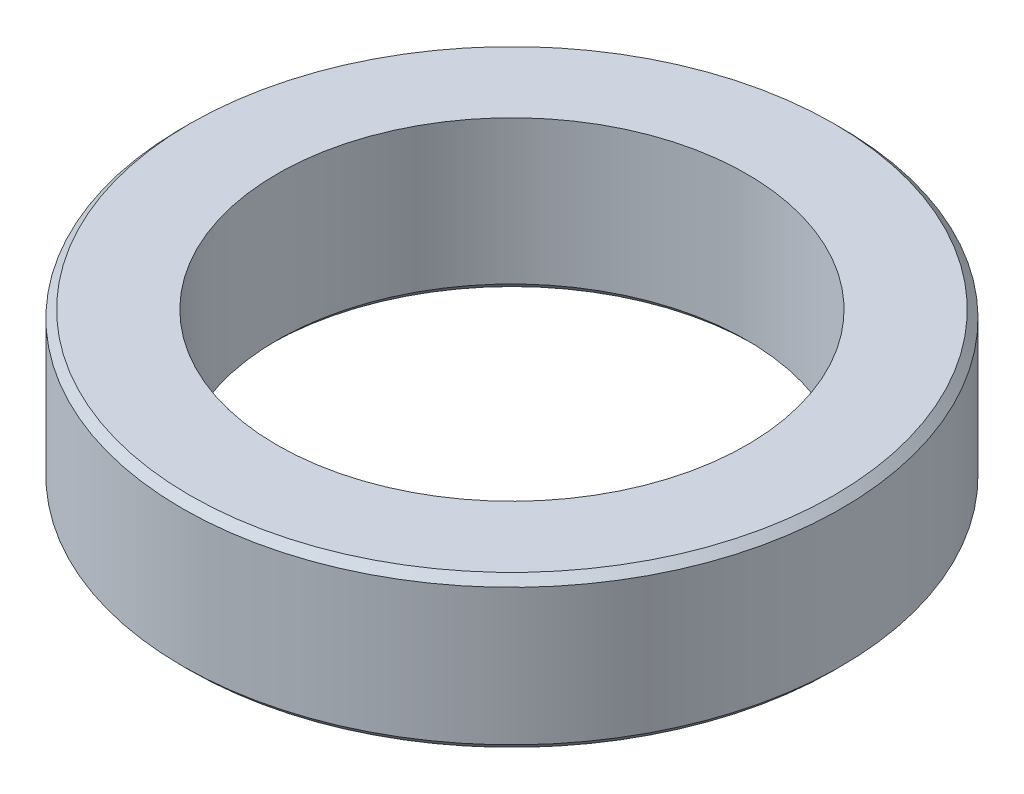
ISO-10303-21;
HEADER;
FILE_DESCRIPTION(('STEP AP214'),'2;1');
FILE_NAME('part.step','',(''),(''),'','','');
FILE_SCHEMA(('AUTOMOTIVE_DESIGN { 1 0 10303 214 1 1 1 1 }'));
ENDSEC;
DATA;
#1=APPLICATION_CONTEXT('core data for automotive mechanical design processes');
#2=APPLICATION_PROTOCOL_DEFINITION('international standard','automotive_design',2000,#1);
#3=PRODUCT_CONTEXT('',#1,'mechanical');
#4=PRODUCT('Part','Part','',(#3));
#5=PRODUCT_RELATED_PRODUCT_CATEGORY('part','',(#4));
#6=PRODUCT_DEFINITION_FORMATION('','',#4);
#7=PRODUCT_DEFINITION_CONTEXT('part definition',#1,'design');
#8=PRODUCT_DEFINITION('design','',#6,#7);
#9=PRODUCT_DEFINITION_SHAPE('','',#8);
#10=(LENGTH_UNIT() NAMED_UNIT(*) SI_UNIT(.MILLI.,.METRE.));
#11=(NAMED_UNIT(*) PLANE_ANGLE_UNIT() SI_UNIT($,.RADIAN.));
#12=(NAMED_UNIT(*) SI_UNIT($,.STERADIAN.) SOLID_ANGLE_UNIT());
#13=UNCERTAINTY_MEASURE_WITH_UNIT(LENGTH_MEASURE(1.E-05),#10,'distance_accuracy_value','');
#14=(GEOMETRIC_REPRESENTATION_CONTEXT(3) GLOBAL_UNCERTAINTY_ASSIGNED_CONTEXT((#13)) GLOBAL_UNIT_ASSIGNED_CONTEXT((#10,
#11,#12)) REPRESENTATION_CONTEXT('',''));
#15=CARTESIAN_POINT('',(0.,0.,0.));
#16=DIRECTION('',(0.,0.,1.));
#17=DIRECTION('',(1.,0.,0.));
#18=AXIS2_PLACEMENT_3D('',#15,#16,#17);
#19=CARTESIAN_POINT('',(0.,50.8,0.));
#20=DIRECTION('',(0.,1.,0.));
#21=DIRECTION('',(0.,0.,1.));
#22=AXIS2_PLACEMENT_3D('',#19,#20,#21);
#23=PLANE('',#22);
#24=CARTESIAN_POINT('',(0.,50.8,0.));
#25=DIRECTION('',(0.,1.,0.));
#26=DIRECTION('',(0.,0.,1.));
#27=AXIS2_PLACEMENT_3D('',#24,#25,#26);
#28=CIRCLE('',#27,107.95);
#29=CARTESIAN_POINT('',(0.,50.8,107.95));
#30=VERTEX_POINT('',#29);
#31=EDGE_CURVE('E65',#30,#30,#28,.T.);
#32=ORIENTED_EDGE('',*,*,#31,.T.);
#33=EDGE_LOOP('',(#32));
#34=FACE_BOUND('',#33,.T.);
#35=CARTESIAN_POINT('',(0.,50.8,0.));
#36=DIRECTION('',(0.,1.,0.));
#37=DIRECTION('',(0.,0.,1.));
#38=AXIS2_PLACEMENT_3D('',#35,#36,#37);
#39=CIRCLE('',#38,78.74);
#40=CARTESIAN_POINT('',(0.,50.8,78.74));
#41=VERTEX_POINT('',#40);
#42=EDGE_CURVE('E68',#41,#41,#39,.T.);
#43=ORIENTED_EDGE('',*,*,#42,.F.);
#44=EDGE_LOOP('',(#43));
#45=FACE_BOUND('',#44,.T.);
#46=ADVANCED_FACE('F41',(#34,#45),#23,.T.);
#47=CARTESIAN_POINT('',(0.,0.,0.));
#48=DIRECTION('',(0.,1.,0.));
#49=DIRECTION('',(0.,0.,1.));
#50=AXIS2_PLACEMENT_3D('',#47,#48,#49);
#51=PLANE('',#50);
#52=CARTESIAN_POINT('',(0.,0.,0.));
#53=DIRECTION('',(0.,1.,0.));
#54=DIRECTION('',(0.,0.,1.));
#55=AXIS2_PLACEMENT_3D('',#52,#53,#54);
#56=CIRCLE('',#55,107.95);
#57=CARTESIAN_POINT('',(0.,0.,107.95));
#58=VERTEX_POINT('',#57);
#59=EDGE_CURVE('E49',#58,#58,#56,.F.);
#60=ORIENTED_EDGE('',*,*,#59,.T.);
#61=EDGE_LOOP('',(#60));
#62=FACE_BOUND('',#61,.T.);
#63=CARTESIAN_POINT('',(0.,0.,0.));
#64=DIRECTION('',(0.,1.,0.));
#65=DIRECTION('',(0.,0.,1.));
#66=AXIS2_PLACEMENT_3D('',#63,#64,#65);
#67=CIRCLE('',#66,81.28);
#68=CARTESIAN_POINT('',(0.,0.,81.28));
#69=VERTEX_POINT('',#68);
#70=EDGE_CURVE('E53',#69,#69,#67,.T.);
#71=ORIENTED_EDGE('',*,*,#70,.T.);
#72=EDGE_LOOP('',(#71));
#73=FACE_BOUND('',#72,.T.);
#74=ADVANCED_FACE('F75',(#62,#73),#51,.F.);
#75=CARTESIAN_POINT('',(0.,50.8,0.));
#76=DIRECTION('',(0.,-1.,0.));
#77=DIRECTION('',(0.,0.,-1.));
#78=AXIS2_PLACEMENT_3D('',#75,#76,#77);
#79=CYLINDRICAL_SURFACE('',#78,110.49);
#80=CARTESIAN_POINT('',(0.,48.26,0.));
#81=DIRECTION('',(0.,1.,0.));
#82=DIRECTION('',(0.,0.,1.));
#83=AXIS2_PLACEMENT_3D('',#80,#81,#82);
#84=CIRCLE('',#83,110.49);
#85=CARTESIAN_POINT('',(0.,48.26,110.49));
#86=VERTEX_POINT('',#85);
#87=EDGE_CURVE('E57',#86,#86,#84,.F.);
#88=ORIENTED_EDGE('',*,*,#87,.T.);
#89=EDGE_LOOP('',(#88));
#90=FACE_BOUND('',#89,.T.);
#91=CARTESIAN_POINT('',(0.,2.53999999999997,0.));
#92=DIRECTION('',(0.,1.,0.));
#93=DIRECTION('',(0.,0.,1.));
#94=AXIS2_PLACEMENT_3D('',#91,#92,#93);
#95=CIRCLE('',#94,110.49);
#96=CARTESIAN_POINT('',(0.,2.53999999999997,110.49));
#97=VERTEX_POINT('',#96);
#98=EDGE_CURVE('E62',#97,#97,#95,.T.);
#99=ORIENTED_EDGE('',*,*,#98,.T.);
#100=EDGE_LOOP('',(#99));
#101=FACE_BOUND('',#100,.T.);
#102=ADVANCED_FACE('F81',(#90,#101),#79,.T.);
#103=CARTESIAN_POINT('',(0.,50.8,0.));
#104=DIRECTION('',(0.,-1.,0.));
#105=DIRECTION('',(0.,0.,-1.));
#106=AXIS2_PLACEMENT_3D('',#103,#104,#105);
#107=CYLINDRICAL_SURFACE('',#106,78.74);
#108=CARTESIAN_POINT('',(0.,2.54000000000001,0.));
#109=DIRECTION('',(0.,1.,0.));
#110=DIRECTION('',(0.,0.,1.));
#111=AXIS2_PLACEMENT_3D('',#108,#109,#110);
#112=CIRCLE('',#111,78.74);
#113=CARTESIAN_POINT('',(0.,2.54000000000001,78.74));
#114=VERTEX_POINT('',#113);
#115=EDGE_CURVE('E10',#114,#114,#112,.F.);
#116=ORIENTED_EDGE('',*,*,#115,.T.);
#117=EDGE_LOOP('',(#116));
#118=FACE_BOUND('',#117,.T.);
#119=ORIENTED_EDGE('',*,*,#42,.T.);
#120=EDGE_LOOP('',(#119));
#121=FACE_BOUND('',#120,.T.);
#122=ADVANCED_FACE('F72',(#118,#121),#107,.F.);
#123=CARTESIAN_POINT('',(0.,50.8,0.));
#124=DIRECTION('',(0.,-1.,0.));
#125=DIRECTION('',(0.,0.,-1.));
#126=AXIS2_PLACEMENT_3D('',#123,#124,#125);
#127=CONICAL_SURFACE('',#126,107.95,0.785398163397437);
#128=ORIENTED_EDGE('',*,*,#87,.F.);
#129=EDGE_LOOP('',(#128));
#130=FACE_BOUND('',#129,.T.);
#131=ORIENTED_EDGE('',*,*,#31,.F.);
#132=EDGE_LOOP('',(#131));
#133=FACE_BOUND('',#132,.T.);
#134=ADVANCED_FACE('F89',(#130,#133),#127,.T.);
#135=CARTESIAN_POINT('',(0.,2.53999999999997,0.));
#136=DIRECTION('',(0.,1.,0.));
#137=DIRECTION('',(0.,0.,1.));
#138=AXIS2_PLACEMENT_3D('',#135,#136,#137);
#139=CONICAL_SURFACE('',#138,110.49,0.785398163397454);
#140=ORIENTED_EDGE('',*,*,#59,.F.);
#141=EDGE_LOOP('',(#140));
#142=FACE_BOUND('',#141,.T.);
#143=ORIENTED_EDGE('',*,*,#98,.F.);
#144=EDGE_LOOP('',(#143));
#145=FACE_BOUND('',#144,.T.);
#146=ADVANCED_FACE('F94',(#142,#145),#139,.T.);
#147=CARTESIAN_POINT('',(0.,0.,0.));
#148=DIRECTION('',(0.,-1.,0.));
#149=DIRECTION('',(0.,0.,-1.));
#150=AXIS2_PLACEMENT_3D('',#147,#148,#149);
#151=CONICAL_SURFACE('',#150,81.28,0.785398163397443);
#152=ORIENTED_EDGE('',*,*,#115,.F.);
#153=EDGE_LOOP('',(#152));
#154=FACE_BOUND('',#153,.T.);
#155=ORIENTED_EDGE('',*,*,#70,.F.);
#156=EDGE_LOOP('',(#155));
#157=FACE_BOUND('',#156,.T.);
#158=ADVANCED_FACE('F44',(#154,#157),#151,.F.);
#159=CLOSED_SHELL('',(#46,#74,#102,#122,#134,#146,#158));
#160=MANIFOLD_SOLID_BREP('B2',#159);
#161=ADVANCED_BREP_SHAPE_REPRESENTATION('',(#18,#160),#14);
#162=SHAPE_DEFINITION_REPRESENTATION(#9,#161);
ENDSEC;
END-ISO-10303-21;
